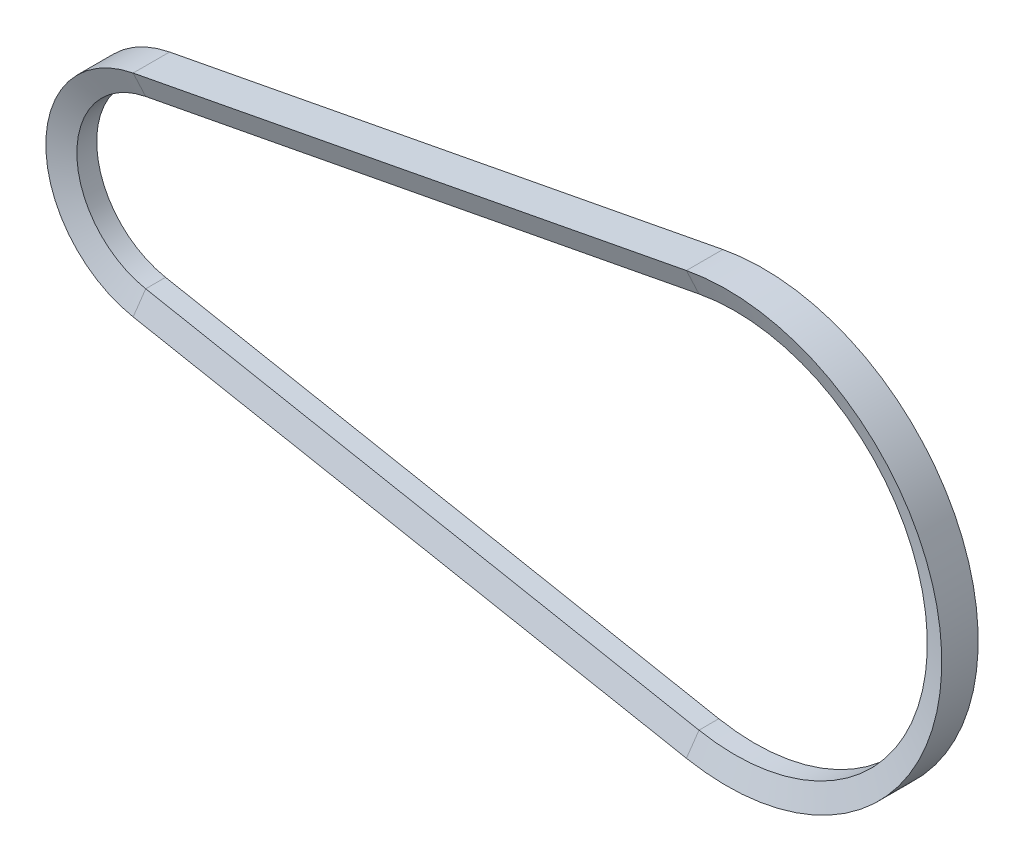
ISO-10303-21;
HEADER;
FILE_DESCRIPTION(('STEP AP214'),'2;1');
FILE_NAME('part.step','',(''),(''),'','','');
FILE_SCHEMA(('AUTOMOTIVE_DESIGN { 1 0 10303 214 1 1 1 1 }'));
ENDSEC;
DATA;
#1=APPLICATION_CONTEXT('core data for automotive mechanical design processes');
#2=APPLICATION_PROTOCOL_DEFINITION('international standard','automotive_design',2000,#1);
#3=PRODUCT_CONTEXT('',#1,'mechanical');
#4=PRODUCT('Part','Part','',(#3));
#5=PRODUCT_RELATED_PRODUCT_CATEGORY('part','',(#4));
#6=PRODUCT_DEFINITION_FORMATION('','',#4);
#7=PRODUCT_DEFINITION_CONTEXT('part definition',#1,'design');
#8=PRODUCT_DEFINITION('design','',#6,#7);
#9=PRODUCT_DEFINITION_SHAPE('','',#8);
#10=(LENGTH_UNIT() NAMED_UNIT(*) SI_UNIT(.MILLI.,.METRE.));
#11=(NAMED_UNIT(*) PLANE_ANGLE_UNIT() SI_UNIT($,.RADIAN.));
#12=(NAMED_UNIT(*) SI_UNIT($,.STERADIAN.) SOLID_ANGLE_UNIT());
#13=UNCERTAINTY_MEASURE_WITH_UNIT(LENGTH_MEASURE(1.E-05),#10,'distance_accuracy_value','');
#14=(GEOMETRIC_REPRESENTATION_CONTEXT(3) GLOBAL_UNCERTAINTY_ASSIGNED_CONTEXT((#13)) GLOBAL_UNIT_ASSIGNED_CONTEXT((#10,
#11,#12)) REPRESENTATION_CONTEXT('',''));
#15=CARTESIAN_POINT('',(0.,0.,0.));
#16=DIRECTION('',(0.,0.,1.));
#17=DIRECTION('',(1.,0.,0.));
#18=AXIS2_PLACEMENT_3D('',#15,#16,#17);
#19=CARTESIAN_POINT('',(0.,0.,0.));
#20=DIRECTION('',(0.,0.,-1.));
#21=DIRECTION('',(-1.,0.,0.));
#22=AXIS2_PLACEMENT_3D('',#19,#20,#21);
#23=CYLINDRICAL_SURFACE('',#22,29.5625);
#24=DIRECTION('',(0.,0.,-1.));
#25=VECTOR('',#24,1.);
#26=CARTESIAN_POINT('',(-5.5429687500009,-29.0381973215713,3.46098626551201));
#27=LINE('',#26,#25);
#28=CARTESIAN_POINT('',(-5.5429687500009,-29.0381973215713,3.46098626551201));
#29=VERTEX_POINT('',#28);
#30=CARTESIAN_POINT('',(-5.5429687500009,-29.0381973215713,-3.46098626551201));
#31=VERTEX_POINT('',#30);
#32=EDGE_CURVE('E260',#29,#31,#27,.T.);
#33=ORIENTED_EDGE('',*,*,#32,.T.);
#34=CARTESIAN_POINT('',(0.,0.,-3.46098626551201));
#35=DIRECTION('',(0.,0.,-1.));
#36=DIRECTION('',(-1.,0.,0.));
#37=AXIS2_PLACEMENT_3D('',#34,#35,#36);
#38=CIRCLE('',#37,29.5625);
#39=CARTESIAN_POINT('',(-5.54296874999999,29.0381973215715,-3.46098626551201));
#40=VERTEX_POINT('',#39);
#41=EDGE_CURVE('E43',#31,#40,#38,.T.);
#42=ORIENTED_EDGE('',*,*,#41,.T.);
#43=CARTESIAN_POINT('',(-5.54296874999996,29.0381973215715,3.46098626551201));
#44=DIRECTION('',(0.,0.,-1.));
#45=VECTOR('',#44,1.);
#46=LINE('',#43,#45);
#47=CARTESIAN_POINT('',(-5.54296874999909,29.0381973215717,3.46098626551201));
#48=VERTEX_POINT('',#47);
#49=EDGE_CURVE('E212',#48,#40,#46,.T.);
#50=ORIENTED_EDGE('',*,*,#49,.F.);
#51=CARTESIAN_POINT('',(0.,0.,3.46098626551201));
#52=DIRECTION('',(0.,0.,-1.));
#53=DIRECTION('',(-1.,0.,0.));
#54=AXIS2_PLACEMENT_3D('',#51,#52,#53);
#55=CIRCLE('',#54,29.5625);
#56=EDGE_CURVE('E11',#29,#48,#55,.T.);
#57=ORIENTED_EDGE('',*,*,#56,.F.);
#58=EDGE_LOOP('',(#33,#42,#50,#57));
#59=FACE_BOUND('',#58,.T.);
#60=ADVANCED_FACE('F32',(#59),#23,.F.);
#61=CARTESIAN_POINT('',(0.,0.,-3.46098626551201));
#62=DIRECTION('',(0.,0.,-1.));
#63=DIRECTION('',(-1.,0.,0.));
#64=AXIS2_PLACEMENT_3D('',#61,#62,#63);
#65=CONICAL_SURFACE('',#64,29.5625,1.22173047639603);
#66=DIRECTION('',(-0.17619236639737,-0.923026798951571,-0.342020143325669));
#67=VECTOR('',#66,1.);
#68=CARTESIAN_POINT('',(-7.03125000000102,-36.8349226066444,-6.35));
#69=LINE('',#68,#67);
#70=CARTESIAN_POINT('',(-7.03125000000102,-36.8349226066444,-6.35));
#71=VERTEX_POINT('',#70);
#72=EDGE_CURVE('E255',#31,#71,#69,.T.);
#73=ORIENTED_EDGE('',*,*,#72,.T.);
#74=CARTESIAN_POINT('',(0.,0.,-6.35));
#75=DIRECTION('',(0.,0.,-1.));
#76=DIRECTION('',(-1.,0.,0.));
#77=AXIS2_PLACEMENT_3D('',#74,#75,#76);
#78=CIRCLE('',#77,37.5);
#79=CARTESIAN_POINT('',(-7.03125,36.8349226066446,-6.35));
#80=VERTEX_POINT('',#79);
#81=EDGE_CURVE('E211',#71,#80,#78,.T.);
#82=ORIENTED_EDGE('',*,*,#81,.T.);
#83=CARTESIAN_POINT('',(-5.54296874999999,29.0381973215715,-3.46098626551202));
#84=DIRECTION('',(-0.176192366397358,0.923026798951573,-0.342020143325669));
#85=VECTOR('',#84,1.);
#86=LINE('',#83,#85);
#87=EDGE_CURVE('E235',#40,#80,#86,.T.);
#88=ORIENTED_EDGE('',*,*,#87,.F.);
#89=ORIENTED_EDGE('',*,*,#41,.F.);
#90=EDGE_LOOP('',(#73,#82,#88,#89));
#91=FACE_BOUND('',#90,.T.);
#92=ADVANCED_FACE('F240',(#91),#65,.F.);
#93=CARTESIAN_POINT('',(0.,0.,0.));
#94=DIRECTION('',(0.,0.,-1.));
#95=DIRECTION('',(-1.,0.,0.));
#96=AXIS2_PLACEMENT_3D('',#93,#94,#95);
#97=CYLINDRICAL_SURFACE('',#96,37.5);
#98=DIRECTION('',(0.,0.,1.));
#99=VECTOR('',#98,1.);
#100=CARTESIAN_POINT('',(-7.03125000000102,-36.8349226066444,-6.35));
#101=LINE('',#100,#99);
#102=CARTESIAN_POINT('',(-7.03125000000102,-36.8349226066444,6.35));
#103=VERTEX_POINT('',#102);
#104=EDGE_CURVE('E261',#71,#103,#101,.T.);
#105=ORIENTED_EDGE('',*,*,#104,.T.);
#106=CARTESIAN_POINT('',(0.,0.,6.35));
#107=DIRECTION('',(0.,0.,-1.));
#108=DIRECTION('',(-1.,0.,0.));
#109=AXIS2_PLACEMENT_3D('',#106,#107,#108);
#110=CIRCLE('',#109,37.5);
#111=CARTESIAN_POINT('',(-7.03124999999898,36.8349226066448,6.35));
#112=VERTEX_POINT('',#111);
#113=EDGE_CURVE('E204',#103,#112,#110,.T.);
#114=ORIENTED_EDGE('',*,*,#113,.T.);
#115=CARTESIAN_POINT('',(-7.03124999999996,36.8349226066446,-6.35));
#116=DIRECTION('',(0.,0.,1.));
#117=VECTOR('',#116,1.);
#118=LINE('',#115,#117);
#119=EDGE_CURVE('E281',#80,#112,#118,.T.);
#120=ORIENTED_EDGE('',*,*,#119,.F.);
#121=ORIENTED_EDGE('',*,*,#81,.F.);
#122=EDGE_LOOP('',(#105,#114,#120,#121));
#123=FACE_BOUND('',#122,.T.);
#124=ADVANCED_FACE('F197',(#123),#97,.T.);
#125=CARTESIAN_POINT('',(0.,0.,6.35));
#126=DIRECTION('',(0.,0.,1.));
#127=DIRECTION('',(1.,0.,0.));
#128=AXIS2_PLACEMENT_3D('',#125,#126,#127);
#129=CONICAL_SURFACE('',#128,37.5,1.22173047639603);
#130=DIRECTION('',(0.17619236639737,0.923026798951571,-0.342020143325669));
#131=VECTOR('',#130,1.);
#132=CARTESIAN_POINT('',(-7.03125000000102,-36.8349226066444,6.35));
#133=LINE('',#132,#131);
#134=EDGE_CURVE('E114',#103,#29,#133,.T.);
#135=ORIENTED_EDGE('',*,*,#134,.T.);
#136=ORIENTED_EDGE('',*,*,#56,.T.);
#137=CARTESIAN_POINT('',(-7.03125000000004,36.8349226066446,6.35));
#138=DIRECTION('',(0.176192366397361,-0.923026798951572,-0.342020143325669));
#139=VECTOR('',#138,1.);
#140=LINE('',#137,#139);
#141=EDGE_CURVE('E51',#112,#48,#140,.T.);
#142=ORIENTED_EDGE('',*,*,#141,.F.);
#143=ORIENTED_EDGE('',*,*,#113,.F.);
#144=EDGE_LOOP('',(#135,#136,#142,#143));
#145=FACE_BOUND('',#144,.T.);
#146=ADVANCED_FACE('F193',(#145),#129,.F.);
#147=CARTESIAN_POINT('',(187.425781249999,-65.873119928216,3.46098626551201));
#148=DIRECTION('',(0.1875,0.982264602843857,0.));
#149=DIRECTION('',(-0.982264602843857,0.1875,0.));
#150=AXIS2_PLACEMENT_3D('',#147,#148,#149);
#151=PLANE('',#150);
#152=DIRECTION('',(0.,0.,-1.));
#153=VECTOR('',#152,1.);
#154=CARTESIAN_POINT('',(187.425781249999,-65.873119928216,3.46098626551201));
#155=LINE('',#154,#153);
#156=CARTESIAN_POINT('',(187.425781249999,-65.873119928216,3.46098626551201));
#157=VERTEX_POINT('',#156);
#158=CARTESIAN_POINT('',(187.425781249999,-65.873119928216,-3.46098626551201));
#159=VERTEX_POINT('',#158);
#160=EDGE_CURVE('E111',#157,#159,#155,.T.);
#161=ORIENTED_EDGE('',*,*,#160,.T.);
#162=DIRECTION('',(-0.982264602843857,0.1875,0.));
#163=VECTOR('',#162,1.);
#164=CARTESIAN_POINT('',(187.425781249999,-65.873119928216,-3.46098626551201));
#165=LINE('',#164,#163);
#166=EDGE_CURVE('E274',#159,#31,#165,.T.);
#167=ORIENTED_EDGE('',*,*,#166,.T.);
#168=ORIENTED_EDGE('',*,*,#32,.F.);
#169=DIRECTION('',(-0.982264602843857,0.1875,0.));
#170=VECTOR('',#169,1.);
#171=CARTESIAN_POINT('',(187.425781249999,-65.873119928216,3.46098626551201));
#172=LINE('',#171,#170);
#173=EDGE_CURVE('E276',#157,#29,#172,.T.);
#174=ORIENTED_EDGE('',*,*,#173,.F.);
#175=EDGE_LOOP('',(#161,#167,#168,#174));
#176=FACE_BOUND('',#175,.T.);
#177=ADVANCED_FACE('F189',(#176),#151,.T.);
#178=CARTESIAN_POINT('',(185.937499999999,-73.6698452132891,-6.35));
#179=DIRECTION('',(0.064128776873563,0.335954280248388,-0.939692620785908));
#180=DIRECTION('',(0.,0.941630844008638,0.336647224274284));
#181=AXIS2_PLACEMENT_3D('',#178,#179,#180);
#182=PLANE('',#181);
#183=DIRECTION('',(-0.17619236639737,-0.923026798951571,-0.342020143325669));
#184=VECTOR('',#183,1.);
#185=CARTESIAN_POINT('',(185.937499999999,-73.6698452132891,-6.35));
#186=LINE('',#185,#184);
#187=CARTESIAN_POINT('',(185.937499999999,-73.6698452132891,-6.35));
#188=VERTEX_POINT('',#187);
#189=EDGE_CURVE('E272',#159,#188,#186,.T.);
#190=ORIENTED_EDGE('',*,*,#189,.T.);
#191=DIRECTION('',(-0.982264602843857,0.1875,0.));
#192=VECTOR('',#191,1.);
#193=CARTESIAN_POINT('',(185.937499999999,-73.6698452132891,-6.35));
#194=LINE('',#193,#192);
#195=EDGE_CURVE('E266',#188,#71,#194,.T.);
#196=ORIENTED_EDGE('',*,*,#195,.T.);
#197=ORIENTED_EDGE('',*,*,#72,.F.);
#198=ORIENTED_EDGE('',*,*,#166,.F.);
#199=EDGE_LOOP('',(#190,#196,#197,#198));
#200=FACE_BOUND('',#199,.T.);
#201=ADVANCED_FACE('F185',(#200),#182,.T.);
#202=CARTESIAN_POINT('',(185.937499999999,-73.6698452132891,-6.35));
#203=DIRECTION('',(-0.1875,-0.982264602843857,0.));
#204=DIRECTION('',(0.982264602843857,-0.1875,0.));
#205=AXIS2_PLACEMENT_3D('',#202,#203,#204);
#206=PLANE('',#205);
#207=DIRECTION('',(0.,0.,1.));
#208=VECTOR('',#207,1.);
#209=CARTESIAN_POINT('',(185.937499999999,-73.6698452132891,-6.35));
#210=LINE('',#209,#208);
#211=CARTESIAN_POINT('',(185.937499999999,-73.6698452132891,6.35));
#212=VERTEX_POINT('',#211);
#213=EDGE_CURVE('E137',#188,#212,#210,.T.);
#214=ORIENTED_EDGE('',*,*,#213,.T.);
#215=DIRECTION('',(-0.982264602843857,0.1875,0.));
#216=VECTOR('',#215,1.);
#217=CARTESIAN_POINT('',(185.937499999999,-73.6698452132891,6.35));
#218=LINE('',#217,#216);
#219=EDGE_CURVE('E268',#212,#103,#218,.T.);
#220=ORIENTED_EDGE('',*,*,#219,.T.);
#221=ORIENTED_EDGE('',*,*,#104,.F.);
#222=ORIENTED_EDGE('',*,*,#195,.F.);
#223=EDGE_LOOP('',(#214,#220,#221,#222));
#224=FACE_BOUND('',#223,.T.);
#225=ADVANCED_FACE('F181',(#224),#206,.T.);
#226=CARTESIAN_POINT('',(185.937499999999,-73.6698452132891,6.35));
#227=DIRECTION('',(0.0641287768735631,0.335954280248388,0.939692620785908));
#228=DIRECTION('',(0.,-0.941630844008638,0.336647224274284));
#229=AXIS2_PLACEMENT_3D('',#226,#227,#228);
#230=PLANE('',#229);
#231=DIRECTION('',(0.17619236639737,0.923026798951571,-0.342020143325669));
#232=VECTOR('',#231,1.);
#233=CARTESIAN_POINT('',(185.937499999999,-73.6698452132891,6.35));
#234=LINE('',#233,#232);
#235=EDGE_CURVE('E134',#212,#157,#234,.T.);
#236=ORIENTED_EDGE('',*,*,#235,.T.);
#237=ORIENTED_EDGE('',*,*,#173,.T.);
#238=ORIENTED_EDGE('',*,*,#134,.F.);
#239=ORIENTED_EDGE('',*,*,#219,.F.);
#240=EDGE_LOOP('',(#236,#237,#238,#239));
#241=FACE_BOUND('',#240,.T.);
#242=ADVANCED_FACE('F178',(#241),#230,.T.);
#243=CARTESIAN_POINT('',(200.,0.,0.));
#244=DIRECTION('',(0.,0.,-1.));
#245=DIRECTION('',(-1.,0.,0.));
#246=AXIS2_PLACEMENT_3D('',#243,#244,#245);
#247=CYLINDRICAL_SURFACE('',#246,67.0625);
#248=DIRECTION('',(0.,0.,-1.));
#249=VECTOR('',#248,1.);
#250=CARTESIAN_POINT('',(187.42578125,65.8731199282162,3.46098626551201));
#251=LINE('',#250,#249);
#252=CARTESIAN_POINT('',(187.42578125,65.8731199282162,3.46098626551201));
#253=VERTEX_POINT('',#252);
#254=CARTESIAN_POINT('',(187.42578125,65.8731199282162,-3.46098626551201));
#255=VERTEX_POINT('',#254);
#256=EDGE_CURVE('E108',#253,#255,#251,.T.);
#257=ORIENTED_EDGE('',*,*,#256,.T.);
#258=CARTESIAN_POINT('',(200.,0.,-3.46098626551201));
#259=DIRECTION('',(0.,0.,-1.));
#260=DIRECTION('',(-1.,0.,0.));
#261=AXIS2_PLACEMENT_3D('',#258,#259,#260);
#262=CIRCLE('',#261,67.0625);
#263=EDGE_CURVE('E115',#255,#159,#262,.T.);
#264=ORIENTED_EDGE('',*,*,#263,.T.);
#265=ORIENTED_EDGE('',*,*,#160,.F.);
#266=CARTESIAN_POINT('',(200.,0.,3.46098626551201));
#267=DIRECTION('',(0.,0.,-1.));
#268=DIRECTION('',(-1.,0.,0.));
#269=AXIS2_PLACEMENT_3D('',#266,#267,#268);
#270=CIRCLE('',#269,67.0625);
#271=EDGE_CURVE('E103',#253,#157,#270,.T.);
#272=ORIENTED_EDGE('',*,*,#271,.F.);
#273=EDGE_LOOP('',(#257,#264,#265,#272));
#274=FACE_BOUND('',#273,.T.);
#275=ADVANCED_FACE('F105',(#274),#247,.F.);
#276=CARTESIAN_POINT('',(200.,0.,-3.46098626551201));
#277=DIRECTION('',(0.,0.,-1.));
#278=DIRECTION('',(-1.,0.,0.));
#279=AXIS2_PLACEMENT_3D('',#276,#277,#278);
#280=CONICAL_SURFACE('',#279,67.0625,1.22173047639603);
#281=DIRECTION('',(-0.176192366397358,0.923026798951573,-0.342020143325669));
#282=VECTOR('',#281,1.);
#283=CARTESIAN_POINT('',(185.9375,73.6698452132893,-6.35));
#284=LINE('',#283,#282);
#285=CARTESIAN_POINT('',(185.9375,73.6698452132893,-6.35));
#286=VERTEX_POINT('',#285);
#287=EDGE_CURVE('E131',#255,#286,#284,.T.);
#288=ORIENTED_EDGE('',*,*,#287,.T.);
#289=CARTESIAN_POINT('',(200.,0.,-6.35));
#290=DIRECTION('',(0.,0.,-1.));
#291=DIRECTION('',(-1.,0.,0.));
#292=AXIS2_PLACEMENT_3D('',#289,#290,#291);
#293=CIRCLE('',#292,75.);
#294=EDGE_CURVE('E304',#286,#188,#293,.T.);
#295=ORIENTED_EDGE('',*,*,#294,.T.);
#296=ORIENTED_EDGE('',*,*,#189,.F.);
#297=ORIENTED_EDGE('',*,*,#263,.F.);
#298=EDGE_LOOP('',(#288,#295,#296,#297));
#299=FACE_BOUND('',#298,.T.);
#300=ADVANCED_FACE('F171',(#299),#280,.F.);
#301=CARTESIAN_POINT('',(200.,0.,0.));
#302=DIRECTION('',(0.,0.,-1.));
#303=DIRECTION('',(-1.,0.,0.));
#304=AXIS2_PLACEMENT_3D('',#301,#302,#303);
#305=CYLINDRICAL_SURFACE('',#304,75.);
#306=DIRECTION('',(0.,0.,1.));
#307=VECTOR('',#306,1.);
#308=CARTESIAN_POINT('',(185.9375,73.6698452132893,-6.35));
#309=LINE('',#308,#307);
#310=CARTESIAN_POINT('',(185.9375,73.6698452132893,6.35));
#311=VERTEX_POINT('',#310);
#312=EDGE_CURVE('E296',#286,#311,#309,.T.);
#313=ORIENTED_EDGE('',*,*,#312,.T.);
#314=CARTESIAN_POINT('',(200.,0.,6.35));
#315=DIRECTION('',(0.,0.,-1.));
#316=DIRECTION('',(-1.,0.,0.));
#317=AXIS2_PLACEMENT_3D('',#314,#315,#316);
#318=CIRCLE('',#317,75.);
#319=EDGE_CURVE('E121',#311,#212,#318,.T.);
#320=ORIENTED_EDGE('',*,*,#319,.T.);
#321=ORIENTED_EDGE('',*,*,#213,.F.);
#322=ORIENTED_EDGE('',*,*,#294,.F.);
#323=EDGE_LOOP('',(#313,#320,#321,#322));
#324=FACE_BOUND('',#323,.T.);
#325=ADVANCED_FACE('F168',(#324),#305,.T.);
#326=CARTESIAN_POINT('',(200.,0.,6.35));
#327=DIRECTION('',(0.,0.,1.));
#328=DIRECTION('',(1.,0.,0.));
#329=AXIS2_PLACEMENT_3D('',#326,#327,#328);
#330=CONICAL_SURFACE('',#329,75.,1.22173047639603);
#331=DIRECTION('',(0.176192366397358,-0.923026798951573,-0.342020143325669));
#332=VECTOR('',#331,1.);
#333=CARTESIAN_POINT('',(185.9375,73.6698452132893,6.35));
#334=LINE('',#333,#332);
#335=EDGE_CURVE('E118',#311,#253,#334,.T.);
#336=ORIENTED_EDGE('',*,*,#335,.T.);
#337=ORIENTED_EDGE('',*,*,#271,.T.);
#338=ORIENTED_EDGE('',*,*,#235,.F.);
#339=ORIENTED_EDGE('',*,*,#319,.F.);
#340=EDGE_LOOP('',(#336,#337,#338,#339));
#341=FACE_BOUND('',#340,.T.);
#342=ADVANCED_FACE('F119',(#341),#330,.F.);
#343=CARTESIAN_POINT('',(185.9375,73.6698452132893,6.35));
#344=DIRECTION('',(-0.0641287768735631,0.335954280248388,-0.939692620785908));
#345=DIRECTION('',(0.,0.941630844008638,0.336647224274284));
#346=AXIS2_PLACEMENT_3D('',#343,#344,#345);
#347=PLANE('',#346);
#348=ORIENTED_EDGE('',*,*,#141,.T.);
#349=DIRECTION('',(-0.982264602843857,-0.1875,0.));
#350=VECTOR('',#349,1.);
#351=CARTESIAN_POINT('',(187.42578125,65.8731199282162,3.46098626551201));
#352=LINE('',#351,#350);
#353=EDGE_CURVE('E126',#253,#48,#352,.T.);
#354=ORIENTED_EDGE('',*,*,#353,.F.);
#355=ORIENTED_EDGE('',*,*,#335,.F.);
#356=DIRECTION('',(-0.982264602843857,-0.1875,0.));
#357=VECTOR('',#356,1.);
#358=CARTESIAN_POINT('',(185.9375,73.6698452132893,6.35));
#359=LINE('',#358,#357);
#360=EDGE_CURVE('E153',#311,#112,#359,.T.);
#361=ORIENTED_EDGE('',*,*,#360,.T.);
#362=EDGE_LOOP('',(#348,#354,#355,#361));
#363=FACE_BOUND('',#362,.T.);
#364=ADVANCED_FACE('F133',(#363),#347,.F.);
#365=CARTESIAN_POINT('',(187.42578125,65.8731199282162,3.46098626551201));
#366=DIRECTION('',(-0.1875,0.982264602843857,0.));
#367=DIRECTION('',(-0.982264602843857,-0.1875,0.));
#368=AXIS2_PLACEMENT_3D('',#365,#366,#367);
#369=PLANE('',#368);
#370=ORIENTED_EDGE('',*,*,#49,.T.);
#371=DIRECTION('',(-0.982264602843857,-0.1875,0.));
#372=VECTOR('',#371,1.);
#373=CARTESIAN_POINT('',(187.42578125,65.8731199282162,-3.46098626551201));
#374=LINE('',#373,#372);
#375=EDGE_CURVE('E129',#255,#40,#374,.T.);
#376=ORIENTED_EDGE('',*,*,#375,.F.);
#377=ORIENTED_EDGE('',*,*,#256,.F.);
#378=ORIENTED_EDGE('',*,*,#353,.T.);
#379=EDGE_LOOP('',(#370,#376,#377,#378));
#380=FACE_BOUND('',#379,.T.);
#381=ADVANCED_FACE('F125',(#380),#369,.F.);
#382=CARTESIAN_POINT('',(185.9375,73.6698452132893,-6.35));
#383=DIRECTION('',(-0.0641287768735631,0.335954280248388,0.939692620785908));
#384=DIRECTION('',(0.,-0.941630844008638,0.336647224274284));
#385=AXIS2_PLACEMENT_3D('',#382,#383,#384);
#386=PLANE('',#385);
#387=ORIENTED_EDGE('',*,*,#87,.T.);
#388=DIRECTION('',(-0.982264602843857,-0.1875,0.));
#389=VECTOR('',#388,1.);
#390=CARTESIAN_POINT('',(185.9375,73.6698452132893,-6.35));
#391=LINE('',#390,#389);
#392=EDGE_CURVE('E139',#286,#80,#391,.T.);
#393=ORIENTED_EDGE('',*,*,#392,.F.);
#394=ORIENTED_EDGE('',*,*,#287,.F.);
#395=ORIENTED_EDGE('',*,*,#375,.T.);
#396=EDGE_LOOP('',(#387,#393,#394,#395));
#397=FACE_BOUND('',#396,.T.);
#398=ADVANCED_FACE('F292',(#397),#386,.F.);
#399=CARTESIAN_POINT('',(185.9375,73.6698452132893,-6.35));
#400=DIRECTION('',(0.1875,-0.982264602843857,0.));
#401=DIRECTION('',(0.982264602843857,0.1875,0.));
#402=AXIS2_PLACEMENT_3D('',#399,#400,#401);
#403=PLANE('',#402);
#404=ORIENTED_EDGE('',*,*,#119,.T.);
#405=ORIENTED_EDGE('',*,*,#360,.F.);
#406=ORIENTED_EDGE('',*,*,#312,.F.);
#407=ORIENTED_EDGE('',*,*,#392,.T.);
#408=EDGE_LOOP('',(#404,#405,#406,#407));
#409=FACE_BOUND('',#408,.T.);
#410=ADVANCED_FACE('F310',(#409),#403,.F.);
#411=CLOSED_SHELL('',(#60,#92,#124,#146,#177,#201,#225,#242,#275,#300,#325,#342,#364,#381,#398,#410));
#412=MANIFOLD_SOLID_BREP('B2',#411);
#413=ADVANCED_BREP_SHAPE_REPRESENTATION('',(#18,#412),#14);
#414=SHAPE_DEFINITION_REPRESENTATION(#9,#413);
ENDSEC;
END-ISO-10303-21;
